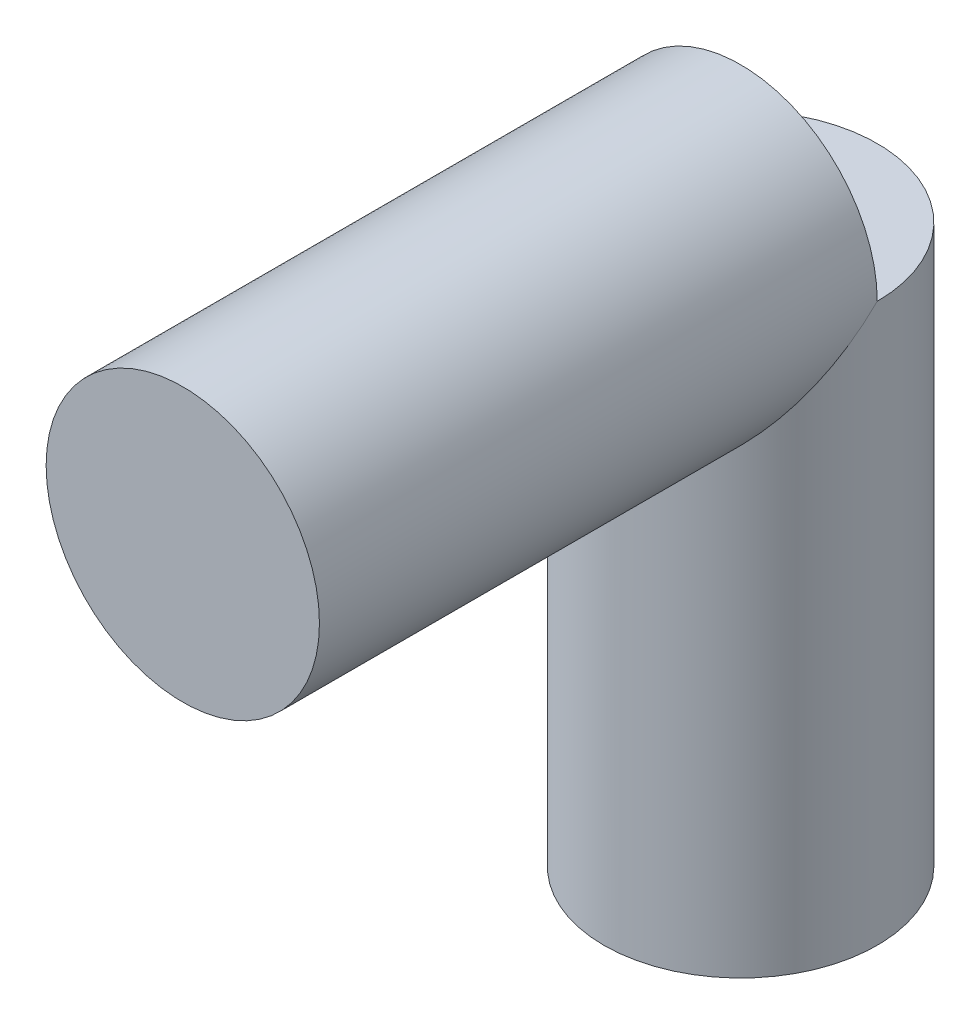
ISO-10303-21;
HEADER;
FILE_DESCRIPTION(('STEP AP214'),'2;1');
FILE_NAME('part.step','',(''),(''),'','','');
FILE_SCHEMA(('AUTOMOTIVE_DESIGN { 1 0 10303 214 1 1 1 1 }'));
ENDSEC;
DATA;
#1=APPLICATION_CONTEXT('core data for automotive mechanical design processes');
#2=APPLICATION_PROTOCOL_DEFINITION('international standard','automotive_design',2000,#1);
#3=PRODUCT_CONTEXT('',#1,'mechanical');
#4=PRODUCT('Part','Part','',(#3));
#5=PRODUCT_RELATED_PRODUCT_CATEGORY('part','',(#4));
#6=PRODUCT_DEFINITION_FORMATION('','',#4);
#7=PRODUCT_DEFINITION_CONTEXT('part definition',#1,'design');
#8=PRODUCT_DEFINITION('design','',#6,#7);
#9=PRODUCT_DEFINITION_SHAPE('','',#8);
#10=(LENGTH_UNIT() NAMED_UNIT(*) SI_UNIT(.MILLI.,.METRE.));
#11=(NAMED_UNIT(*) PLANE_ANGLE_UNIT() SI_UNIT($,.RADIAN.));
#12=(NAMED_UNIT(*) SI_UNIT($,.STERADIAN.) SOLID_ANGLE_UNIT());
#13=UNCERTAINTY_MEASURE_WITH_UNIT(LENGTH_MEASURE(1.E-05),#10,'distance_accuracy_value','');
#14=(GEOMETRIC_REPRESENTATION_CONTEXT(3) GLOBAL_UNCERTAINTY_ASSIGNED_CONTEXT((#13)) GLOBAL_UNIT_ASSIGNED_CONTEXT((#10,
#11,#12)) REPRESENTATION_CONTEXT('',''));
#15=CARTESIAN_POINT('',(0.,0.,0.));
#16=DIRECTION('',(0.,0.,1.));
#17=DIRECTION('',(1.,0.,0.));
#18=AXIS2_PLACEMENT_3D('',#15,#16,#17);
#19=CARTESIAN_POINT('',(0.,20.,0.));
#20=DIRECTION('',(0.,-1.,0.));
#21=DIRECTION('',(0.,0.,-1.));
#22=AXIS2_PLACEMENT_3D('',#19,#20,#21);
#23=CYLINDRICAL_SURFACE('',#22,4.9);
#24=CARTESIAN_POINT('',(0.,0.,0.));
#25=DIRECTION('',(0.,1.,0.));
#26=DIRECTION('',(0.,0.,1.));
#27=AXIS2_PLACEMENT_3D('',#24,#25,#26);
#28=CIRCLE('',#27,4.9);
#29=CARTESIAN_POINT('',(0.,0.,4.9));
#30=VERTEX_POINT('',#29);
#31=EDGE_CURVE('E59',#30,#30,#28,.T.);
#32=ORIENTED_EDGE('',*,*,#31,.T.);
#33=EDGE_LOOP('',(#32));
#34=FACE_BOUND('',#33,.T.);
#35=CARTESIAN_POINT('',(0.,20.,0.));
#36=DIRECTION('',(0.,-0.707106781186547,-0.707106781186547));
#37=DIRECTION('',(0.,-0.707106781186547,0.707106781186547));
#38=AXIS2_PLACEMENT_3D('',#35,#36,#37);
#39=ELLIPSE('',#38,6.92964645562817,4.9);
#40=CARTESIAN_POINT('',(-4.9,20.,0.));
#41=VERTEX_POINT('',#40);
#42=CARTESIAN_POINT('',(4.9,20.,0.));
#43=VERTEX_POINT('',#42);
#44=EDGE_CURVE('E55',#41,#43,#39,.F.);
#45=ORIENTED_EDGE('',*,*,#44,.F.);
#46=CARTESIAN_POINT('',(0.,20.,0.));
#47=DIRECTION('',(0.,1.,0.));
#48=DIRECTION('',(0.,0.,1.));
#49=AXIS2_PLACEMENT_3D('',#46,#47,#48);
#50=CIRCLE('',#49,4.9);
#51=EDGE_CURVE('E40',#43,#41,#50,.T.);
#52=ORIENTED_EDGE('',*,*,#51,.F.);
#53=EDGE_LOOP('',(#45,#52));
#54=FACE_BOUND('',#53,.T.);
#55=ADVANCED_FACE('F33',(#34,#54),#23,.T.);
#56=CARTESIAN_POINT('',(0.,20.,0.));
#57=DIRECTION('',(0.,1.,0.));
#58=DIRECTION('',(0.,0.,1.));
#59=AXIS2_PLACEMENT_3D('',#56,#57,#58);
#60=PLANE('',#59);
#61=ORIENTED_EDGE('',*,*,#51,.T.);
#62=DIRECTION('',(1.,0.,0.));
#63=VECTOR('',#62,1.);
#64=CARTESIAN_POINT('',(0.,20.,0.));
#65=LINE('',#64,#63);
#66=EDGE_CURVE('E11',#41,#43,#65,.T.);
#67=ORIENTED_EDGE('',*,*,#66,.T.);
#68=EDGE_LOOP('',(#61,#67));
#69=FACE_BOUND('',#68,.T.);
#70=ADVANCED_FACE('F61',(#69),#60,.T.);
#71=CARTESIAN_POINT('',(0.,0.,0.));
#72=DIRECTION('',(0.,1.,0.));
#73=DIRECTION('',(0.,0.,1.));
#74=AXIS2_PLACEMENT_3D('',#71,#72,#73);
#75=PLANE('',#74);
#76=ORIENTED_EDGE('',*,*,#31,.F.);
#77=EDGE_LOOP('',(#76));
#78=FACE_BOUND('',#77,.T.);
#79=ADVANCED_FACE('F71',(#78),#75,.F.);
#80=CARTESIAN_POINT('',(0.,20.,20.));
#81=DIRECTION('',(0.,0.,-1.));
#82=DIRECTION('',(-1.,0.,0.));
#83=AXIS2_PLACEMENT_3D('',#80,#81,#82);
#84=CYLINDRICAL_SURFACE('',#83,4.9);
#85=CARTESIAN_POINT('',(0.,20.,20.));
#86=DIRECTION('',(0.,0.,1.));
#87=DIRECTION('',(1.,0.,0.));
#88=AXIS2_PLACEMENT_3D('',#85,#86,#87);
#89=CIRCLE('',#88,4.9);
#90=CARTESIAN_POINT('',(4.9,20.,20.));
#91=VERTEX_POINT('',#90);
#92=EDGE_CURVE('E56',#91,#91,#89,.T.);
#93=ORIENTED_EDGE('',*,*,#92,.F.);
#94=EDGE_LOOP('',(#93));
#95=FACE_BOUND('',#94,.T.);
#96=CARTESIAN_POINT('',(0.,20.,0.));
#97=DIRECTION('',(0.,0.,1.));
#98=DIRECTION('',(1.,0.,0.));
#99=AXIS2_PLACEMENT_3D('',#96,#97,#98);
#100=CIRCLE('',#99,4.9);
#101=EDGE_CURVE('E46',#43,#41,#100,.T.);
#102=ORIENTED_EDGE('',*,*,#101,.T.);
#103=ORIENTED_EDGE('',*,*,#44,.T.);
#104=EDGE_LOOP('',(#102,#103));
#105=FACE_BOUND('',#104,.T.);
#106=ADVANCED_FACE('F54',(#95,#105),#84,.T.);
#107=CARTESIAN_POINT('',(0.,20.,20.));
#108=DIRECTION('',(0.,0.,1.));
#109=DIRECTION('',(1.,0.,0.));
#110=AXIS2_PLACEMENT_3D('',#107,#108,#109);
#111=PLANE('',#110);
#112=ORIENTED_EDGE('',*,*,#92,.T.);
#113=EDGE_LOOP('',(#112));
#114=FACE_BOUND('',#113,.T.);
#115=ADVANCED_FACE('F68',(#114),#111,.T.);
#116=CARTESIAN_POINT('',(0.,20.,0.));
#117=DIRECTION('',(0.,0.,1.));
#118=DIRECTION('',(1.,0.,0.));
#119=AXIS2_PLACEMENT_3D('',#116,#117,#118);
#120=PLANE('',#119);
#121=ORIENTED_EDGE('',*,*,#66,.F.);
#122=ORIENTED_EDGE('',*,*,#101,.F.);
#123=EDGE_LOOP('',(#121,#122));
#124=FACE_BOUND('',#123,.T.);
#125=ADVANCED_FACE('F48',(#124),#120,.F.);
#126=CLOSED_SHELL('',(#55,#70,#79,#106,#115,#125));
#127=MANIFOLD_SOLID_BREP('B2',#126);
#128=ADVANCED_BREP_SHAPE_REPRESENTATION('',(#18,#127),#14);
#129=SHAPE_DEFINITION_REPRESENTATION(#9,#128);
ENDSEC;
END-ISO-10303-21;
